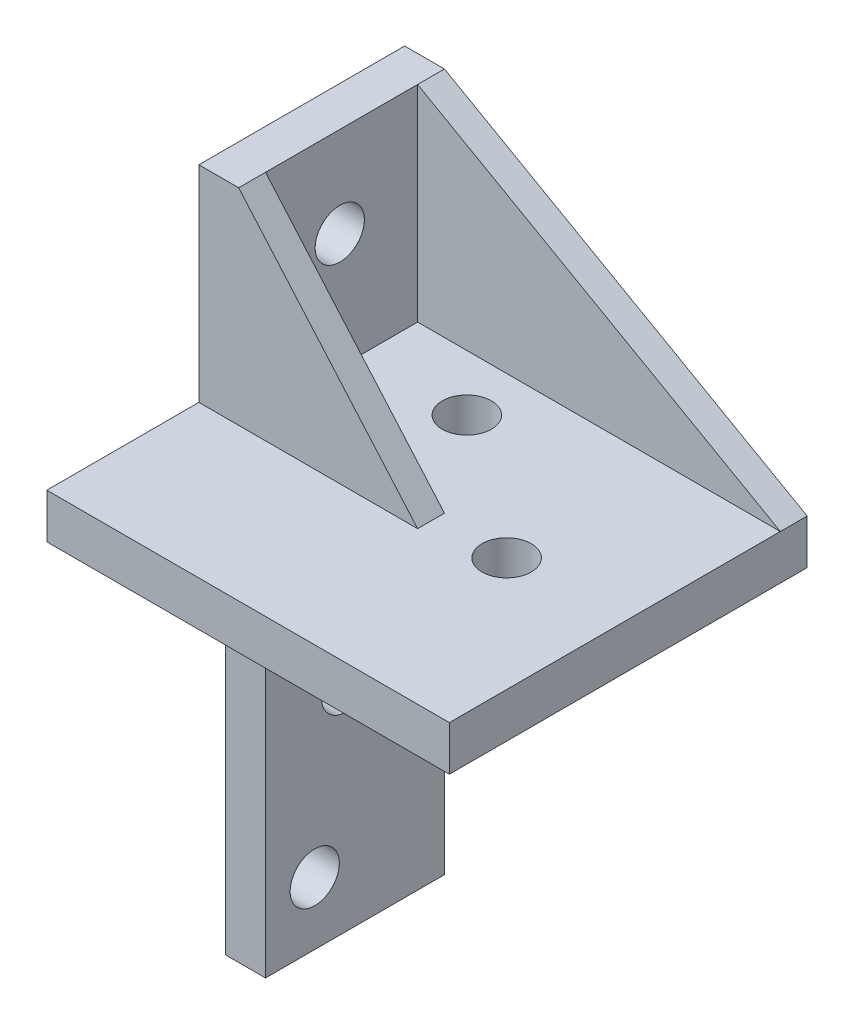
ISO-10303-21;
HEADER;
FILE_DESCRIPTION(('STEP AP214'),'2;1');
FILE_NAME('part.step','',(''),(''),'','','');
FILE_SCHEMA(('AUTOMOTIVE_DESIGN { 1 0 10303 214 1 1 1 1 }'));
ENDSEC;
DATA;
#1=APPLICATION_CONTEXT('core data for automotive mechanical design processes');
#2=APPLICATION_PROTOCOL_DEFINITION('international standard','automotive_design',2000,#1);
#3=PRODUCT_CONTEXT('',#1,'mechanical');
#4=PRODUCT('Part','Part','',(#3));
#5=PRODUCT_RELATED_PRODUCT_CATEGORY('part','',(#4));
#6=PRODUCT_DEFINITION_FORMATION('','',#4);
#7=PRODUCT_DEFINITION_CONTEXT('part definition',#1,'design');
#8=PRODUCT_DEFINITION('design','',#6,#7);
#9=PRODUCT_DEFINITION_SHAPE('','',#8);
#10=(LENGTH_UNIT() NAMED_UNIT(*) SI_UNIT(.MILLI.,.METRE.));
#11=(NAMED_UNIT(*) PLANE_ANGLE_UNIT() SI_UNIT($,.RADIAN.));
#12=(NAMED_UNIT(*) SI_UNIT($,.STERADIAN.) SOLID_ANGLE_UNIT());
#13=UNCERTAINTY_MEASURE_WITH_UNIT(LENGTH_MEASURE(1.E-05),#10,'distance_accuracy_value','');
#14=(GEOMETRIC_REPRESENTATION_CONTEXT(3) GLOBAL_UNCERTAINTY_ASSIGNED_CONTEXT((#13)) GLOBAL_UNIT_ASSIGNED_CONTEXT((#10,
#11,#12)) REPRESENTATION_CONTEXT('',''));
#15=CARTESIAN_POINT('',(0.,0.,0.));
#16=DIRECTION('',(0.,0.,1.));
#17=DIRECTION('',(1.,0.,0.));
#18=AXIS2_PLACEMENT_3D('',#15,#16,#17);
#19=CARTESIAN_POINT('',(4.45,0.,0.));
#20=DIRECTION('',(0.,0.,-1.));
#21=DIRECTION('',(-1.,0.,0.));
#22=AXIS2_PLACEMENT_3D('',#19,#20,#21);
#23=PLANE('',#22);
#24=DIRECTION('',(0.,-1.,0.));
#25=VECTOR('',#24,1.);
#26=CARTESIAN_POINT('',(0.,0.,0.));
#27=LINE('',#26,#25);
#28=CARTESIAN_POINT('',(0.,50.,0.));
#29=VERTEX_POINT('',#28);
#30=CARTESIAN_POINT('',(0.,0.,0.));
#31=VERTEX_POINT('',#30);
#32=EDGE_CURVE('E90',#29,#31,#27,.T.);
#33=ORIENTED_EDGE('',*,*,#32,.T.);
#34=DIRECTION('',(-1.,0.,0.));
#35=VECTOR('',#34,1.);
#36=CARTESIAN_POINT('',(4.45,0.,0.));
#37=LINE('',#36,#35);
#38=CARTESIAN_POINT('',(4.45,0.,0.));
#39=VERTEX_POINT('',#38);
#40=EDGE_CURVE('E11',#39,#31,#37,.T.);
#41=ORIENTED_EDGE('',*,*,#40,.F.);
#42=DIRECTION('',(0.,-1.,0.));
#43=VECTOR('',#42,1.);
#44=CARTESIAN_POINT('',(4.45,0.,0.));
#45=LINE('',#44,#43);
#46=CARTESIAN_POINT('',(4.45,50.,0.));
#47=VERTEX_POINT('',#46);
#48=EDGE_CURVE('E83',#47,#39,#45,.T.);
#49=ORIENTED_EDGE('',*,*,#48,.F.);
#50=DIRECTION('',(-1.,0.,0.));
#51=VECTOR('',#50,1.);
#52=CARTESIAN_POINT('',(4.45,50.,0.));
#53=LINE('',#52,#51);
#54=EDGE_CURVE('E48',#47,#29,#53,.T.);
#55=ORIENTED_EDGE('',*,*,#54,.T.);
#56=EDGE_LOOP('',(#33,#41,#49,#55));
#57=FACE_BOUND('',#56,.T.);
#58=ADVANCED_FACE('F32',(#57),#23,.F.);
#59=CARTESIAN_POINT('',(4.45,0.,0.));
#60=DIRECTION('',(0.,1.,0.));
#61=DIRECTION('',(0.,0.,1.));
#62=AXIS2_PLACEMENT_3D('',#59,#60,#61);
#63=PLANE('',#62);
#64=DIRECTION('',(0.,0.,-1.));
#65=VECTOR('',#64,1.);
#66=CARTESIAN_POINT('',(0.,0.,0.));
#67=LINE('',#66,#65);
#68=CARTESIAN_POINT('',(0.,0.,-20.));
#69=VERTEX_POINT('',#68);
#70=EDGE_CURVE('E61',#31,#69,#67,.T.);
#71=ORIENTED_EDGE('',*,*,#70,.T.);
#72=DIRECTION('',(-1.,0.,0.));
#73=VECTOR('',#72,1.);
#74=CARTESIAN_POINT('',(4.45,0.,-20.));
#75=LINE('',#74,#73);
#76=CARTESIAN_POINT('',(4.45,0.,-20.));
#77=VERTEX_POINT('',#76);
#78=EDGE_CURVE('E40',#77,#69,#75,.T.);
#79=ORIENTED_EDGE('',*,*,#78,.F.);
#80=DIRECTION('',(0.,0.,-1.));
#81=VECTOR('',#80,1.);
#82=CARTESIAN_POINT('',(4.45,0.,0.));
#83=LINE('',#82,#81);
#84=EDGE_CURVE('E73',#39,#77,#83,.T.);
#85=ORIENTED_EDGE('',*,*,#84,.F.);
#86=ORIENTED_EDGE('',*,*,#40,.T.);
#87=EDGE_LOOP('',(#71,#79,#85,#86));
#88=FACE_BOUND('',#87,.T.);
#89=ADVANCED_FACE('F75',(#88),#63,.F.);
#90=CARTESIAN_POINT('',(4.45,0.,-20.));
#91=DIRECTION('',(0.,0.,1.));
#92=DIRECTION('',(1.,0.,0.));
#93=AXIS2_PLACEMENT_3D('',#90,#91,#92);
#94=PLANE('',#93);
#95=DIRECTION('',(0.,1.,0.));
#96=VECTOR('',#95,1.);
#97=CARTESIAN_POINT('',(0.,0.,-20.));
#98=LINE('',#97,#96);
#99=CARTESIAN_POINT('',(0.,78.,-20.));
#100=VERTEX_POINT('',#99);
#101=EDGE_CURVE('E88',#69,#100,#98,.T.);
#102=ORIENTED_EDGE('',*,*,#101,.T.);
#103=DIRECTION('',(-1.,0.,0.));
#104=VECTOR('',#103,1.);
#105=CARTESIAN_POINT('',(0.,78.,-20.));
#106=LINE('',#105,#104);
#107=CARTESIAN_POINT('',(4.45,78.,-20.));
#108=VERTEX_POINT('',#107);
#109=EDGE_CURVE('E128',#108,#100,#106,.T.);
#110=ORIENTED_EDGE('',*,*,#109,.F.);
#111=DIRECTION('',(0.869822762844102,-0.493364329110095,0.));
#112=VECTOR('',#111,1.);
#113=CARTESIAN_POINT('',(45.,55.,-20.));
#114=LINE('',#113,#112);
#115=CARTESIAN_POINT('',(45.,55.,-20.));
#116=VERTEX_POINT('',#115);
#117=EDGE_CURVE('E206',#108,#116,#114,.T.);
#118=ORIENTED_EDGE('',*,*,#117,.T.);
#119=DIRECTION('',(0.,-1.,0.));
#120=VECTOR('',#119,1.);
#121=CARTESIAN_POINT('',(45.,55.,-20.));
#122=LINE('',#121,#120);
#123=CARTESIAN_POINT('',(45.,50.,-20.));
#124=VERTEX_POINT('',#123);
#125=EDGE_CURVE('E176',#116,#124,#122,.T.);
#126=ORIENTED_EDGE('',*,*,#125,.T.);
#127=DIRECTION('',(-1.,0.,0.));
#128=VECTOR('',#127,1.);
#129=CARTESIAN_POINT('',(0.,50.,-20.));
#130=LINE('',#129,#128);
#131=CARTESIAN_POINT('',(4.45,50.,-20.));
#132=VERTEX_POINT('',#131);
#133=EDGE_CURVE('E170',#124,#132,#130,.T.);
#134=ORIENTED_EDGE('',*,*,#133,.T.);
#135=DIRECTION('',(0.,1.,0.));
#136=VECTOR('',#135,1.);
#137=CARTESIAN_POINT('',(4.45,0.,-20.));
#138=LINE('',#137,#136);
#139=EDGE_CURVE('E82',#77,#132,#138,.T.);
#140=ORIENTED_EDGE('',*,*,#139,.F.);
#141=ORIENTED_EDGE('',*,*,#78,.T.);
#142=EDGE_LOOP('',(#102,#110,#118,#126,#134,#140,#141));
#143=FACE_BOUND('',#142,.T.);
#144=ADVANCED_FACE('F104',(#143),#94,.F.);
#145=CARTESIAN_POINT('',(4.45,0.,0.));
#146=DIRECTION('',(-1.,0.,0.));
#147=DIRECTION('',(0.,0.,1.));
#148=AXIS2_PLACEMENT_3D('',#145,#146,#147);
#149=PLANE('',#148);
#150=CARTESIAN_POINT('',(4.45,24.,-9.));
#151=DIRECTION('',(1.,0.,0.));
#152=DIRECTION('',(0.,0.,-1.));
#153=AXIS2_PLACEMENT_3D('',#150,#151,#152);
#154=CIRCLE('',#153,2.75);
#155=CARTESIAN_POINT('',(4.45,24.,-11.75));
#156=VERTEX_POINT('',#155);
#157=EDGE_CURVE('E146',#156,#156,#154,.T.);
#158=ORIENTED_EDGE('',*,*,#157,.F.);
#159=EDGE_LOOP('',(#158));
#160=FACE_BOUND('',#159,.T.);
#161=CARTESIAN_POINT('',(4.45,7.,-5.5));
#162=DIRECTION('',(1.,0.,0.));
#163=DIRECTION('',(0.,0.,-1.));
#164=AXIS2_PLACEMENT_3D('',#161,#162,#163);
#165=CIRCLE('',#164,2.75);
#166=CARTESIAN_POINT('',(4.45,7.,-8.25));
#167=VERTEX_POINT('',#166);
#168=EDGE_CURVE('E141',#167,#167,#165,.T.);
#169=ORIENTED_EDGE('',*,*,#168,.F.);
#170=EDGE_LOOP('',(#169));
#171=FACE_BOUND('',#170,.T.);
#172=ORIENTED_EDGE('',*,*,#48,.T.);
#173=ORIENTED_EDGE('',*,*,#84,.T.);
#174=ORIENTED_EDGE('',*,*,#139,.T.);
#175=DIRECTION('',(0.,0.,1.));
#176=VECTOR('',#175,1.);
#177=CARTESIAN_POINT('',(4.45,50.,0.));
#178=LINE('',#177,#176);
#179=EDGE_CURVE('E65',#132,#47,#178,.T.);
#180=ORIENTED_EDGE('',*,*,#179,.T.);
#181=EDGE_LOOP('',(#172,#173,#174,#180));
#182=FACE_BOUND('',#181,.T.);
#183=ADVANCED_FACE('F86',(#160,#171,#182),#149,.F.);
#184=CARTESIAN_POINT('',(0.,0.,0.));
#185=DIRECTION('',(-1.,0.,0.));
#186=DIRECTION('',(0.,0.,1.));
#187=AXIS2_PLACEMENT_3D('',#184,#185,#186);
#188=PLANE('',#187);
#189=DIRECTION('',(0.,0.,1.));
#190=VECTOR('',#189,1.);
#191=CARTESIAN_POINT('',(0.,55.,-20.));
#192=LINE('',#191,#190);
#193=CARTESIAN_POINT('',(0.,55.,3.));
#194=VERTEX_POINT('',#193);
#195=CARTESIAN_POINT('',(0.,55.,20.));
#196=VERTEX_POINT('',#195);
#197=EDGE_CURVE('E166',#194,#196,#192,.T.);
#198=ORIENTED_EDGE('',*,*,#197,.F.);
#199=DIRECTION('',(0.,-1.,0.));
#200=VECTOR('',#199,1.);
#201=CARTESIAN_POINT('',(0.,78.,3.));
#202=LINE('',#201,#200);
#203=CARTESIAN_POINT('',(0.,78.,3.));
#204=VERTEX_POINT('',#203);
#205=EDGE_CURVE('E117',#204,#194,#202,.T.);
#206=ORIENTED_EDGE('',*,*,#205,.F.);
#207=DIRECTION('',(0.,0.,1.));
#208=VECTOR('',#207,1.);
#209=CARTESIAN_POINT('',(0.,78.,-20.));
#210=LINE('',#209,#208);
#211=EDGE_CURVE('E114',#100,#204,#210,.T.);
#212=ORIENTED_EDGE('',*,*,#211,.F.);
#213=ORIENTED_EDGE('',*,*,#101,.F.);
#214=ORIENTED_EDGE('',*,*,#70,.F.);
#215=ORIENTED_EDGE('',*,*,#32,.F.);
#216=DIRECTION('',(0.,0.,1.));
#217=VECTOR('',#216,1.);
#218=CARTESIAN_POINT('',(0.,50.,-20.));
#219=LINE('',#218,#217);
#220=CARTESIAN_POINT('',(0.,50.,20.));
#221=VERTEX_POINT('',#220);
#222=EDGE_CURVE('E161',#29,#221,#219,.T.);
#223=ORIENTED_EDGE('',*,*,#222,.T.);
#224=DIRECTION('',(0.,-1.,0.));
#225=VECTOR('',#224,1.);
#226=CARTESIAN_POINT('',(0.,55.,20.));
#227=LINE('',#226,#225);
#228=EDGE_CURVE('E92',#196,#221,#227,.T.);
#229=ORIENTED_EDGE('',*,*,#228,.F.);
#230=EDGE_LOOP('',(#198,#206,#212,#213,#214,#215,#223,#229));
#231=FACE_BOUND('',#230,.T.);
#232=CARTESIAN_POINT('',(0.,67.9,-8.3));
#233=DIRECTION('',(1.,0.,0.));
#234=DIRECTION('',(0.,0.,-1.));
#235=AXIS2_PLACEMENT_3D('',#232,#233,#234);
#236=CIRCLE('',#235,2.75);
#237=CARTESIAN_POINT('',(0.,67.9,-11.05));
#238=VERTEX_POINT('',#237);
#239=EDGE_CURVE('E131',#238,#238,#236,.T.);
#240=ORIENTED_EDGE('',*,*,#239,.T.);
#241=EDGE_LOOP('',(#240));
#242=FACE_BOUND('',#241,.T.);
#243=CARTESIAN_POINT('',(0.,24.,-9.));
#244=DIRECTION('',(1.,0.,0.));
#245=DIRECTION('',(0.,0.,-1.));
#246=AXIS2_PLACEMENT_3D('',#243,#244,#245);
#247=CIRCLE('',#246,2.75);
#248=CARTESIAN_POINT('',(0.,24.,-11.75));
#249=VERTEX_POINT('',#248);
#250=EDGE_CURVE('E142',#249,#249,#247,.T.);
#251=ORIENTED_EDGE('',*,*,#250,.T.);
#252=EDGE_LOOP('',(#251));
#253=FACE_BOUND('',#252,.T.);
#254=CARTESIAN_POINT('',(0.,7.,-5.5));
#255=DIRECTION('',(1.,0.,0.));
#256=DIRECTION('',(0.,0.,-1.));
#257=AXIS2_PLACEMENT_3D('',#254,#255,#256);
#258=CIRCLE('',#257,2.75);
#259=CARTESIAN_POINT('',(0.,7.,-8.25));
#260=VERTEX_POINT('',#259);
#261=EDGE_CURVE('E149',#260,#260,#258,.T.);
#262=ORIENTED_EDGE('',*,*,#261,.T.);
#263=EDGE_LOOP('',(#262));
#264=FACE_BOUND('',#263,.T.);
#265=ADVANCED_FACE('F110',(#231,#242,#253,#264),#188,.T.);
#266=CARTESIAN_POINT('',(0.,55.,20.));
#267=DIRECTION('',(0.,0.,-1.));
#268=DIRECTION('',(-1.,0.,0.));
#269=AXIS2_PLACEMENT_3D('',#266,#267,#268);
#270=PLANE('',#269);
#271=DIRECTION('',(1.,0.,0.));
#272=VECTOR('',#271,1.);
#273=CARTESIAN_POINT('',(0.,50.,20.));
#274=LINE('',#273,#272);
#275=CARTESIAN_POINT('',(45.,50.,20.));
#276=VERTEX_POINT('',#275);
#277=EDGE_CURVE('E178',#221,#276,#274,.T.);
#278=ORIENTED_EDGE('',*,*,#277,.T.);
#279=DIRECTION('',(0.,-1.,0.));
#280=VECTOR('',#279,1.);
#281=CARTESIAN_POINT('',(45.,55.,20.));
#282=LINE('',#281,#280);
#283=CARTESIAN_POINT('',(45.,55.,20.));
#284=VERTEX_POINT('',#283);
#285=EDGE_CURVE('E96',#284,#276,#282,.T.);
#286=ORIENTED_EDGE('',*,*,#285,.F.);
#287=DIRECTION('',(1.,0.,0.));
#288=VECTOR('',#287,1.);
#289=CARTESIAN_POINT('',(0.,55.,20.));
#290=LINE('',#289,#288);
#291=EDGE_CURVE('E169',#196,#284,#290,.T.);
#292=ORIENTED_EDGE('',*,*,#291,.F.);
#293=ORIENTED_EDGE('',*,*,#228,.T.);
#294=EDGE_LOOP('',(#278,#286,#292,#293));
#295=FACE_BOUND('',#294,.T.);
#296=ADVANCED_FACE('F232',(#295),#270,.F.);
#297=CARTESIAN_POINT('',(45.,55.,-20.));
#298=DIRECTION('',(-1.,0.,0.));
#299=DIRECTION('',(0.,0.,1.));
#300=AXIS2_PLACEMENT_3D('',#297,#298,#299);
#301=PLANE('',#300);
#302=DIRECTION('',(0.,0.,-1.));
#303=VECTOR('',#302,1.);
#304=CARTESIAN_POINT('',(45.,50.,-20.));
#305=LINE('',#304,#303);
#306=EDGE_CURVE('E181',#276,#124,#305,.T.);
#307=ORIENTED_EDGE('',*,*,#306,.T.);
#308=ORIENTED_EDGE('',*,*,#125,.F.);
#309=DIRECTION('',(0.,0.,-1.));
#310=VECTOR('',#309,1.);
#311=CARTESIAN_POINT('',(45.,55.,-17.));
#312=LINE('',#311,#310);
#313=CARTESIAN_POINT('',(45.,55.,-17.));
#314=VERTEX_POINT('',#313);
#315=EDGE_CURVE('E209',#314,#116,#312,.T.);
#316=ORIENTED_EDGE('',*,*,#315,.F.);
#317=DIRECTION('',(0.,0.,-1.));
#318=VECTOR('',#317,1.);
#319=CARTESIAN_POINT('',(45.,55.,-20.));
#320=LINE('',#319,#318);
#321=EDGE_CURVE('E173',#284,#314,#320,.T.);
#322=ORIENTED_EDGE('',*,*,#321,.F.);
#323=ORIENTED_EDGE('',*,*,#285,.T.);
#324=EDGE_LOOP('',(#307,#308,#316,#322,#323));
#325=FACE_BOUND('',#324,.T.);
#326=ADVANCED_FACE('F193',(#325),#301,.F.);
#327=CARTESIAN_POINT('',(0.,55.,0.));
#328=DIRECTION('',(0.,1.,0.));
#329=DIRECTION('',(0.,0.,1.));
#330=AXIS2_PLACEMENT_3D('',#327,#328,#329);
#331=PLANE('',#330);
#332=DIRECTION('',(1.,0.,0.));
#333=VECTOR('',#332,1.);
#334=CARTESIAN_POINT('',(0.,55.,3.));
#335=LINE('',#334,#333);
#336=CARTESIAN_POINT('',(24.45,55.,3.));
#337=VERTEX_POINT('',#336);
#338=EDGE_CURVE('E240',#194,#337,#335,.T.);
#339=ORIENTED_EDGE('',*,*,#338,.F.);
#340=ORIENTED_EDGE('',*,*,#197,.T.);
#341=ORIENTED_EDGE('',*,*,#291,.T.);
#342=ORIENTED_EDGE('',*,*,#321,.T.);
#343=DIRECTION('',(-1.,0.,0.));
#344=VECTOR('',#343,1.);
#345=CARTESIAN_POINT('',(4.45,55.,-17.));
#346=LINE('',#345,#344);
#347=CARTESIAN_POINT('',(4.45,55.,-17.));
#348=VERTEX_POINT('',#347);
#349=EDGE_CURVE('E266',#314,#348,#346,.T.);
#350=ORIENTED_EDGE('',*,*,#349,.T.);
#351=DIRECTION('',(0.,0.,-1.));
#352=VECTOR('',#351,1.);
#353=CARTESIAN_POINT('',(4.45,55.,-20.));
#354=LINE('',#353,#352);
#355=CARTESIAN_POINT('',(4.45,55.,0.));
#356=VERTEX_POINT('',#355);
#357=EDGE_CURVE('E125',#356,#348,#354,.T.);
#358=ORIENTED_EDGE('',*,*,#357,.F.);
#359=DIRECTION('',(1.,0.,0.));
#360=VECTOR('',#359,1.);
#361=CARTESIAN_POINT('',(4.45,55.,0.));
#362=LINE('',#361,#360);
#363=CARTESIAN_POINT('',(24.45,55.,0.));
#364=VERTEX_POINT('',#363);
#365=EDGE_CURVE('E257',#356,#364,#362,.T.);
#366=ORIENTED_EDGE('',*,*,#365,.T.);
#367=DIRECTION('',(0.,0.,-1.));
#368=VECTOR('',#367,1.);
#369=CARTESIAN_POINT('',(24.45,55.,3.));
#370=LINE('',#369,#368);
#371=EDGE_CURVE('E244',#337,#364,#370,.T.);
#372=ORIENTED_EDGE('',*,*,#371,.F.);
#373=EDGE_LOOP('',(#339,#340,#341,#342,#350,#358,#366,#372));
#374=FACE_BOUND('',#373,.T.);
#375=CARTESIAN_POINT('',(32.25,55.,0.85));
#376=DIRECTION('',(0.,1.,0.));
#377=DIRECTION('',(0.,0.,1.));
#378=AXIS2_PLACEMENT_3D('',#375,#376,#377);
#379=CIRCLE('',#378,2.75);
#380=CARTESIAN_POINT('',(32.25,55.,3.6));
#381=VERTEX_POINT('',#380);
#382=EDGE_CURVE('E154',#381,#381,#379,.T.);
#383=ORIENTED_EDGE('',*,*,#382,.F.);
#384=EDGE_LOOP('',(#383));
#385=FACE_BOUND('',#384,.T.);
#386=CARTESIAN_POINT('',(16.2,55.,-10.75));
#387=DIRECTION('',(0.,1.,0.));
#388=DIRECTION('',(0.,0.,1.));
#389=AXIS2_PLACEMENT_3D('',#386,#387,#388);
#390=CIRCLE('',#389,2.75);
#391=CARTESIAN_POINT('',(16.2,55.,-8.));
#392=VERTEX_POINT('',#391);
#393=EDGE_CURVE('E145',#392,#392,#390,.T.);
#394=ORIENTED_EDGE('',*,*,#393,.F.);
#395=EDGE_LOOP('',(#394));
#396=FACE_BOUND('',#395,.T.);
#397=ADVANCED_FACE('F235',(#374,#385,#396),#331,.T.);
#398=CARTESIAN_POINT('',(0.,50.,0.));
#399=DIRECTION('',(0.,1.,0.));
#400=DIRECTION('',(0.,0.,1.));
#401=AXIS2_PLACEMENT_3D('',#398,#399,#400);
#402=PLANE('',#401);
#403=CARTESIAN_POINT('',(32.25,50.,0.85));
#404=DIRECTION('',(0.,1.,0.));
#405=DIRECTION('',(0.,0.,1.));
#406=AXIS2_PLACEMENT_3D('',#403,#404,#405);
#407=CIRCLE('',#406,2.75);
#408=CARTESIAN_POINT('',(32.25,50.,3.6));
#409=VERTEX_POINT('',#408);
#410=EDGE_CURVE('E157',#409,#409,#407,.F.);
#411=ORIENTED_EDGE('',*,*,#410,.F.);
#412=EDGE_LOOP('',(#411));
#413=FACE_BOUND('',#412,.T.);
#414=CARTESIAN_POINT('',(16.2,50.,-10.75));
#415=DIRECTION('',(0.,1.,0.));
#416=DIRECTION('',(0.,0.,1.));
#417=AXIS2_PLACEMENT_3D('',#414,#415,#416);
#418=CIRCLE('',#417,2.75);
#419=CARTESIAN_POINT('',(16.2,50.,-8.));
#420=VERTEX_POINT('',#419);
#421=EDGE_CURVE('E158',#420,#420,#418,.F.);
#422=ORIENTED_EDGE('',*,*,#421,.F.);
#423=EDGE_LOOP('',(#422));
#424=FACE_BOUND('',#423,.T.);
#425=ORIENTED_EDGE('',*,*,#54,.F.);
#426=ORIENTED_EDGE('',*,*,#179,.F.);
#427=ORIENTED_EDGE('',*,*,#133,.F.);
#428=ORIENTED_EDGE('',*,*,#306,.F.);
#429=ORIENTED_EDGE('',*,*,#277,.F.);
#430=ORIENTED_EDGE('',*,*,#222,.F.);
#431=EDGE_LOOP('',(#425,#426,#427,#428,#429,#430));
#432=FACE_BOUND('',#431,.T.);
#433=ADVANCED_FACE('F201',(#413,#424,#432),#402,.F.);
#434=CARTESIAN_POINT('',(16.2,-0.001000000000001,-10.75));
#435=DIRECTION('',(0.,1.,0.));
#436=DIRECTION('',(0.,0.,1.));
#437=AXIS2_PLACEMENT_3D('',#434,#435,#436);
#438=CYLINDRICAL_SURFACE('',#437,2.75);
#439=CARTESIAN_POINT('',(16.2,55.,-8.));
#440=CARTESIAN_POINT('',(16.2,54.9479166666667,-8.));
#441=CARTESIAN_POINT('',(16.2,54.8958333333333,-8.));
#442=CARTESIAN_POINT('',(16.2,54.7916666666667,-8.));
#443=CARTESIAN_POINT('',(16.2,54.7395833333333,-8.));
#444=CARTESIAN_POINT('',(16.2,54.6354166666667,-8.));
#445=CARTESIAN_POINT('',(16.2,54.5833333333333,-8.));
#446=CARTESIAN_POINT('',(16.2,54.4791666666667,-8.));
#447=CARTESIAN_POINT('',(16.2,54.4270833333333,-8.));
#448=CARTESIAN_POINT('',(16.2,54.3229166666667,-8.));
#449=CARTESIAN_POINT('',(16.2,54.2708333333333,-8.));
#450=CARTESIAN_POINT('',(16.2,54.1666666666667,-8.));
#451=CARTESIAN_POINT('',(16.2,54.1145833333333,-8.));
#452=CARTESIAN_POINT('',(16.2,54.0104166666667,-8.));
#453=CARTESIAN_POINT('',(16.2,53.9583333333333,-8.));
#454=CARTESIAN_POINT('',(16.2,53.8541666666667,-8.));
#455=CARTESIAN_POINT('',(16.2,53.8020833333333,-8.));
#456=CARTESIAN_POINT('',(16.2,53.6979166666667,-8.));
#457=CARTESIAN_POINT('',(16.2,53.6458333333333,-8.));
#458=CARTESIAN_POINT('',(16.2,53.5416666666667,-8.));
#459=CARTESIAN_POINT('',(16.2,53.4895833333333,-8.));
#460=CARTESIAN_POINT('',(16.2,53.3854166666667,-8.));
#461=CARTESIAN_POINT('',(16.2,53.3333333333333,-8.));
#462=CARTESIAN_POINT('',(16.2,53.2291666666667,-8.));
#463=CARTESIAN_POINT('',(16.2,53.1770833333333,-8.));
#464=CARTESIAN_POINT('',(16.2,53.0729166666667,-8.));
#465=CARTESIAN_POINT('',(16.2,53.0208333333333,-8.));
#466=CARTESIAN_POINT('',(16.2,52.9166666666667,-8.));
#467=CARTESIAN_POINT('',(16.2,52.8645833333333,-8.));
#468=CARTESIAN_POINT('',(16.2,52.7604166666667,-8.));
#469=CARTESIAN_POINT('',(16.2,52.7083333333333,-8.));
#470=CARTESIAN_POINT('',(16.2,52.6041666666667,-8.));
#471=CARTESIAN_POINT('',(16.2,52.5520833333333,-8.));
#472=CARTESIAN_POINT('',(16.2,52.4479166666667,-8.));
#473=CARTESIAN_POINT('',(16.2,52.3958333333333,-8.));
#474=CARTESIAN_POINT('',(16.2,52.2916666666667,-8.));
#475=CARTESIAN_POINT('',(16.2,52.2395833333333,-8.));
#476=CARTESIAN_POINT('',(16.2,52.1354166666667,-8.));
#477=CARTESIAN_POINT('',(16.2,52.0833333333333,-8.));
#478=CARTESIAN_POINT('',(16.2,51.9791666666667,-8.));
#479=CARTESIAN_POINT('',(16.2,51.9270833333333,-8.));
#480=CARTESIAN_POINT('',(16.2,51.8229166666667,-8.));
#481=CARTESIAN_POINT('',(16.2,51.7708333333333,-8.));
#482=CARTESIAN_POINT('',(16.2,51.6666666666667,-8.));
#483=CARTESIAN_POINT('',(16.2,51.6145833333333,-8.));
#484=CARTESIAN_POINT('',(16.2,51.5104166666667,-8.));
#485=CARTESIAN_POINT('',(16.2,51.4583333333333,-8.));
#486=CARTESIAN_POINT('',(16.2,51.3541666666667,-8.));
#487=CARTESIAN_POINT('',(16.2,51.3020833333333,-8.));
#488=CARTESIAN_POINT('',(16.2,51.1979166666667,-8.));
#489=CARTESIAN_POINT('',(16.2,51.1458333333333,-8.));
#490=CARTESIAN_POINT('',(16.2,51.0416666666667,-8.));
#491=CARTESIAN_POINT('',(16.2,50.9895833333333,-8.));
#492=CARTESIAN_POINT('',(16.2,50.8854166666667,-8.));
#493=CARTESIAN_POINT('',(16.2,50.8333333333333,-8.));
#494=CARTESIAN_POINT('',(16.2,50.7291666666667,-8.));
#495=CARTESIAN_POINT('',(16.2,50.6770833333333,-8.));
#496=CARTESIAN_POINT('',(16.2,50.5729166666667,-8.));
#497=CARTESIAN_POINT('',(16.2,50.5208333333333,-8.));
#498=CARTESIAN_POINT('',(16.2,50.4166666666667,-8.));
#499=CARTESIAN_POINT('',(16.2,50.3645833333333,-8.));
#500=CARTESIAN_POINT('',(16.2,50.2604166666667,-8.));
#501=CARTESIAN_POINT('',(16.2,50.2083333333333,-8.));
#502=CARTESIAN_POINT('',(16.2,50.1041666666667,-8.));
#503=CARTESIAN_POINT('',(16.2,50.0520833333333,-8.));
#504=CARTESIAN_POINT('',(16.2,50.,-8.));
#505=B_SPLINE_CURVE_WITH_KNOTS('',3,(#439,#440,#441,#442,#443,#444,#445,#446,#447,#448,#449,
#450,#451,#452,#453,#454,#455,#456,#457,#458,#459,#460,#461,#462,#463,#464,#465,#466,#467,#468,
#469,#470,#471,#472,#473,#474,#475,#476,#477,#478,#479,#480,#481,#482,#483,#484,#485,#486,#487,
#488,#489,#490,#491,#492,#493,#494,#495,#496,#497,#498,#499,#500,#501,#502,#503,#504),
.UNSPECIFIED.,.F.,.F.,(4,2,2,2,2,2,2,2,2,2,2,2,2,2,2,2,2,2,2,2,2,2,2,2,2,2,2,2,2,2,2,2,4),(0.,
0.156249999999997,0.3125,0.468750000000004,0.625000000000001,0.781249999999997,
0.937500000000001,1.09375,1.25,1.40625,1.5625,1.71875,1.875,2.03125,2.1875,2.34375000000001,2.5,
2.65625,2.8125,2.96875000000001,3.125,3.28125,3.4375,3.59375000000001,3.75,3.90625,4.0625,
4.21875000000001,4.375,4.53125,4.6875,4.84375000000001,5.),.UNSPECIFIED.);
#506=EDGE_CURVE('BSEAM334',#392,#420,#505,.T.);
#507=ORIENTED_EDGE('',*,*,#393,.T.);
#508=ORIENTED_EDGE('',*,*,#421,.T.);
#509=ORIENTED_EDGE('',*,*,#506,.T.);
#510=ORIENTED_EDGE('',*,*,#506,.F.);
#511=EDGE_LOOP('',(#507,#509,#508,#510));
#512=FACE_BOUND('',#511,.T.);
#513=ADVANCED_FACE('F334',(#512),#438,.F.);
#514=CARTESIAN_POINT('',(32.25,-0.001000000000001,0.85));
#515=DIRECTION('',(0.,1.,0.));
#516=DIRECTION('',(0.,0.,1.));
#517=AXIS2_PLACEMENT_3D('',#514,#515,#516);
#518=CYLINDRICAL_SURFACE('',#517,2.75);
#519=CARTESIAN_POINT('',(32.25,55.,3.6));
#520=CARTESIAN_POINT('',(32.25,54.9479166666667,3.6));
#521=CARTESIAN_POINT('',(32.25,54.8958333333333,3.6));
#522=CARTESIAN_POINT('',(32.25,54.7916666666667,3.6));
#523=CARTESIAN_POINT('',(32.25,54.7395833333333,3.6));
#524=CARTESIAN_POINT('',(32.25,54.6354166666667,3.6));
#525=CARTESIAN_POINT('',(32.25,54.5833333333333,3.6));
#526=CARTESIAN_POINT('',(32.25,54.4791666666667,3.6));
#527=CARTESIAN_POINT('',(32.25,54.4270833333333,3.6));
#528=CARTESIAN_POINT('',(32.25,54.3229166666667,3.6));
#529=CARTESIAN_POINT('',(32.25,54.2708333333333,3.6));
#530=CARTESIAN_POINT('',(32.25,54.1666666666667,3.6));
#531=CARTESIAN_POINT('',(32.25,54.1145833333333,3.6));
#532=CARTESIAN_POINT('',(32.25,54.0104166666667,3.6));
#533=CARTESIAN_POINT('',(32.25,53.9583333333333,3.6));
#534=CARTESIAN_POINT('',(32.25,53.8541666666667,3.6));
#535=CARTESIAN_POINT('',(32.25,53.8020833333333,3.6));
#536=CARTESIAN_POINT('',(32.25,53.6979166666667,3.6));
#537=CARTESIAN_POINT('',(32.25,53.6458333333333,3.6));
#538=CARTESIAN_POINT('',(32.25,53.5416666666667,3.6));
#539=CARTESIAN_POINT('',(32.25,53.4895833333333,3.6));
#540=CARTESIAN_POINT('',(32.25,53.3854166666667,3.6));
#541=CARTESIAN_POINT('',(32.25,53.3333333333333,3.6));
#542=CARTESIAN_POINT('',(32.25,53.2291666666667,3.6));
#543=CARTESIAN_POINT('',(32.25,53.1770833333333,3.6));
#544=CARTESIAN_POINT('',(32.25,53.0729166666667,3.6));
#545=CARTESIAN_POINT('',(32.25,53.0208333333333,3.6));
#546=CARTESIAN_POINT('',(32.25,52.9166666666667,3.6));
#547=CARTESIAN_POINT('',(32.25,52.8645833333333,3.6));
#548=CARTESIAN_POINT('',(32.25,52.7604166666667,3.6));
#549=CARTESIAN_POINT('',(32.25,52.7083333333333,3.6));
#550=CARTESIAN_POINT('',(32.25,52.6041666666667,3.6));
#551=CARTESIAN_POINT('',(32.25,52.5520833333333,3.6));
#552=CARTESIAN_POINT('',(32.25,52.4479166666667,3.6));
#553=CARTESIAN_POINT('',(32.25,52.3958333333333,3.6));
#554=CARTESIAN_POINT('',(32.25,52.2916666666667,3.6));
#555=CARTESIAN_POINT('',(32.25,52.2395833333333,3.6));
#556=CARTESIAN_POINT('',(32.25,52.1354166666667,3.6));
#557=CARTESIAN_POINT('',(32.25,52.0833333333333,3.6));
#558=CARTESIAN_POINT('',(32.25,51.9791666666667,3.6));
#559=CARTESIAN_POINT('',(32.25,51.9270833333333,3.6));
#560=CARTESIAN_POINT('',(32.25,51.8229166666667,3.6));
#561=CARTESIAN_POINT('',(32.25,51.7708333333333,3.6));
#562=CARTESIAN_POINT('',(32.25,51.6666666666667,3.6));
#563=CARTESIAN_POINT('',(32.25,51.6145833333333,3.6));
#564=CARTESIAN_POINT('',(32.25,51.5104166666667,3.6));
#565=CARTESIAN_POINT('',(32.25,51.4583333333333,3.6));
#566=CARTESIAN_POINT('',(32.25,51.3541666666667,3.6));
#567=CARTESIAN_POINT('',(32.25,51.3020833333333,3.6));
#568=CARTESIAN_POINT('',(32.25,51.1979166666667,3.6));
#569=CARTESIAN_POINT('',(32.25,51.1458333333333,3.6));
#570=CARTESIAN_POINT('',(32.25,51.0416666666667,3.6));
#571=CARTESIAN_POINT('',(32.25,50.9895833333333,3.6));
#572=CARTESIAN_POINT('',(32.25,50.8854166666667,3.6));
#573=CARTESIAN_POINT('',(32.25,50.8333333333333,3.6));
#574=CARTESIAN_POINT('',(32.25,50.7291666666667,3.6));
#575=CARTESIAN_POINT('',(32.25,50.6770833333333,3.6));
#576=CARTESIAN_POINT('',(32.25,50.5729166666667,3.6));
#577=CARTESIAN_POINT('',(32.25,50.5208333333333,3.6));
#578=CARTESIAN_POINT('',(32.25,50.4166666666667,3.6));
#579=CARTESIAN_POINT('',(32.25,50.3645833333333,3.6));
#580=CARTESIAN_POINT('',(32.25,50.2604166666667,3.6));
#581=CARTESIAN_POINT('',(32.25,50.2083333333333,3.6));
#582=CARTESIAN_POINT('',(32.25,50.1041666666667,3.6));
#583=CARTESIAN_POINT('',(32.25,50.0520833333333,3.6));
#584=CARTESIAN_POINT('',(32.25,50.,3.6));
#585=B_SPLINE_CURVE_WITH_KNOTS('',3,(#519,#520,#521,#522,#523,#524,#525,#526,#527,#528,#529,
#530,#531,#532,#533,#534,#535,#536,#537,#538,#539,#540,#541,#542,#543,#544,#545,#546,#547,#548,
#549,#550,#551,#552,#553,#554,#555,#556,#557,#558,#559,#560,#561,#562,#563,#564,#565,#566,#567,
#568,#569,#570,#571,#572,#573,#574,#575,#576,#577,#578,#579,#580,#581,#582,#583,#584),
.UNSPECIFIED.,.F.,.F.,(4,2,2,2,2,2,2,2,2,2,2,2,2,2,2,2,2,2,2,2,2,2,2,2,2,2,2,2,2,2,2,2,4),(0.,
0.156249999999997,0.3125,0.468750000000004,0.625000000000001,0.781249999999997,
0.937500000000001,1.09375,1.25,1.40625,1.5625,1.71875,1.875,2.03125,2.1875,2.34375000000001,2.5,
2.65625,2.8125,2.96875000000001,3.125,3.28125,3.4375,3.59375000000001,3.75,3.90625,4.0625,
4.21875000000001,4.375,4.53125,4.6875,4.84375000000001,5.),.UNSPECIFIED.);
#586=EDGE_CURVE('BSEAM340',#381,#409,#585,.T.);
#587=ORIENTED_EDGE('',*,*,#382,.T.);
#588=ORIENTED_EDGE('',*,*,#410,.T.);
#589=ORIENTED_EDGE('',*,*,#586,.T.);
#590=ORIENTED_EDGE('',*,*,#586,.F.);
#591=EDGE_LOOP('',(#587,#589,#588,#590));
#592=FACE_BOUND('',#591,.T.);
#593=ADVANCED_FACE('F340',(#592),#518,.F.);
#594=CARTESIAN_POINT('',(0.,7.,-5.5));
#595=DIRECTION('',(1.,0.,0.));
#596=DIRECTION('',(0.,0.,-1.));
#597=AXIS2_PLACEMENT_3D('',#594,#595,#596);
#598=CYLINDRICAL_SURFACE('',#597,2.75);
#599=ORIENTED_EDGE('',*,*,#261,.F.);
#600=EDGE_LOOP('',(#599));
#601=FACE_BOUND('',#600,.T.);
#602=ORIENTED_EDGE('',*,*,#168,.T.);
#603=EDGE_LOOP('',(#602));
#604=FACE_BOUND('',#603,.T.);
#605=ADVANCED_FACE('F344',(#601,#604),#598,.F.);
#606=CARTESIAN_POINT('',(0.,24.,-9.));
#607=DIRECTION('',(1.,0.,0.));
#608=DIRECTION('',(0.,0.,-1.));
#609=AXIS2_PLACEMENT_3D('',#606,#607,#608);
#610=CYLINDRICAL_SURFACE('',#609,2.75);
#611=ORIENTED_EDGE('',*,*,#250,.F.);
#612=EDGE_LOOP('',(#611));
#613=FACE_BOUND('',#612,.T.);
#614=ORIENTED_EDGE('',*,*,#157,.T.);
#615=EDGE_LOOP('',(#614));
#616=FACE_BOUND('',#615,.T.);
#617=ADVANCED_FACE('F286',(#613,#616),#610,.F.);
#618=CARTESIAN_POINT('',(4.45,78.,-20.));
#619=DIRECTION('',(-1.,0.,0.));
#620=DIRECTION('',(0.,0.,1.));
#621=AXIS2_PLACEMENT_3D('',#618,#619,#620);
#622=PLANE('',#621);
#623=CARTESIAN_POINT('',(4.45,67.9,-8.3));
#624=DIRECTION('',(1.,0.,0.));
#625=DIRECTION('',(0.,0.,-1.));
#626=AXIS2_PLACEMENT_3D('',#623,#624,#625);
#627=CIRCLE('',#626,2.75);
#628=CARTESIAN_POINT('',(4.45,67.9,-11.05));
#629=VERTEX_POINT('',#628);
#630=EDGE_CURVE('E134',#629,#629,#627,.T.);
#631=ORIENTED_EDGE('',*,*,#630,.F.);
#632=EDGE_LOOP('',(#631));
#633=FACE_BOUND('',#632,.T.);
#634=ORIENTED_EDGE('',*,*,#357,.T.);
#635=DIRECTION('',(0.,1.,0.));
#636=VECTOR('',#635,1.);
#637=CARTESIAN_POINT('',(4.45,78.,-17.));
#638=LINE('',#637,#636);
#639=CARTESIAN_POINT('',(4.45,78.,-17.));
#640=VERTEX_POINT('',#639);
#641=EDGE_CURVE('E268',#348,#640,#638,.T.);
#642=ORIENTED_EDGE('',*,*,#641,.T.);
#643=DIRECTION('',(0.,0.,-1.));
#644=VECTOR('',#643,1.);
#645=CARTESIAN_POINT('',(4.45,78.,-20.));
#646=LINE('',#645,#644);
#647=CARTESIAN_POINT('',(4.45,78.,0.));
#648=VERTEX_POINT('',#647);
#649=EDGE_CURVE('E124',#648,#640,#646,.T.);
#650=ORIENTED_EDGE('',*,*,#649,.F.);
#651=DIRECTION('',(0.,-1.,0.));
#652=VECTOR('',#651,1.);
#653=CARTESIAN_POINT('',(4.45,78.,0.));
#654=LINE('',#653,#652);
#655=EDGE_CURVE('E137',#648,#356,#654,.T.);
#656=ORIENTED_EDGE('',*,*,#655,.T.);
#657=EDGE_LOOP('',(#634,#642,#650,#656));
#658=FACE_BOUND('',#657,.T.);
#659=ADVANCED_FACE('F282',(#633,#658),#622,.F.);
#660=CARTESIAN_POINT('',(0.,78.,0.));
#661=DIRECTION('',(0.,1.,0.));
#662=DIRECTION('',(0.,0.,1.));
#663=AXIS2_PLACEMENT_3D('',#660,#661,#662);
#664=PLANE('',#663);
#665=ORIENTED_EDGE('',*,*,#211,.T.);
#666=DIRECTION('',(-1.,0.,0.));
#667=VECTOR('',#666,1.);
#668=CARTESIAN_POINT('',(4.45,78.,3.));
#669=LINE('',#668,#667);
#670=CARTESIAN_POINT('',(4.45,78.,3.));
#671=VERTEX_POINT('',#670);
#672=EDGE_CURVE('E253',#671,#204,#669,.T.);
#673=ORIENTED_EDGE('',*,*,#672,.F.);
#674=DIRECTION('',(0.,0.,-1.));
#675=VECTOR('',#674,1.);
#676=CARTESIAN_POINT('',(4.45,78.,3.));
#677=LINE('',#676,#675);
#678=EDGE_CURVE('E251',#671,#648,#677,.T.);
#679=ORIENTED_EDGE('',*,*,#678,.T.);
#680=ORIENTED_EDGE('',*,*,#649,.T.);
#681=DIRECTION('',(0.,0.,-1.));
#682=VECTOR('',#681,1.);
#683=CARTESIAN_POINT('',(4.45,78.,-17.));
#684=LINE('',#683,#682);
#685=EDGE_CURVE('E272',#640,#108,#684,.T.);
#686=ORIENTED_EDGE('',*,*,#685,.T.);
#687=ORIENTED_EDGE('',*,*,#109,.T.);
#688=EDGE_LOOP('',(#665,#673,#679,#680,#686,#687));
#689=FACE_BOUND('',#688,.T.);
#690=ADVANCED_FACE('F285',(#689),#664,.T.);
#691=CARTESIAN_POINT('',(0.,67.9,-8.3));
#692=DIRECTION('',(1.,0.,0.));
#693=DIRECTION('',(0.,0.,-1.));
#694=AXIS2_PLACEMENT_3D('',#691,#692,#693);
#695=CYLINDRICAL_SURFACE('',#694,2.75);
#696=ORIENTED_EDGE('',*,*,#239,.F.);
#697=EDGE_LOOP('',(#696));
#698=FACE_BOUND('',#697,.T.);
#699=ORIENTED_EDGE('',*,*,#630,.T.);
#700=EDGE_LOOP('',(#699));
#701=FACE_BOUND('',#700,.T.);
#702=ADVANCED_FACE('F280',(#698,#701),#695,.F.);
#703=CARTESIAN_POINT('',(45.,55.,-17.));
#704=DIRECTION('',(0.493364329110095,0.869822762844102,0.));
#705=DIRECTION('',(-0.869822762844102,0.493364329110095,0.));
#706=AXIS2_PLACEMENT_3D('',#703,#704,#705);
#707=PLANE('',#706);
#708=ORIENTED_EDGE('',*,*,#117,.F.);
#709=ORIENTED_EDGE('',*,*,#685,.F.);
#710=DIRECTION('',(0.869822762844102,-0.493364329110095,0.));
#711=VECTOR('',#710,1.);
#712=CARTESIAN_POINT('',(45.,55.,-17.));
#713=LINE('',#712,#711);
#714=EDGE_CURVE('E264',#640,#314,#713,.T.);
#715=ORIENTED_EDGE('',*,*,#714,.T.);
#716=ORIENTED_EDGE('',*,*,#315,.T.);
#717=EDGE_LOOP('',(#708,#709,#715,#716));
#718=FACE_BOUND('',#717,.T.);
#719=ADVANCED_FACE('F297',(#718),#707,.T.);
#720=CARTESIAN_POINT('',(0.,0.,-17.));
#721=DIRECTION('',(0.,0.,1.));
#722=DIRECTION('',(1.,0.,0.));
#723=AXIS2_PLACEMENT_3D('',#720,#721,#722);
#724=PLANE('',#723);
#725=ORIENTED_EDGE('',*,*,#714,.F.);
#726=ORIENTED_EDGE('',*,*,#641,.F.);
#727=ORIENTED_EDGE('',*,*,#349,.F.);
#728=EDGE_LOOP('',(#725,#726,#727));
#729=FACE_BOUND('',#728,.T.);
#730=ADVANCED_FACE('F295',(#729),#724,.T.);
#731=CARTESIAN_POINT('',(0.,0.,0.));
#732=DIRECTION('',(0.,0.,1.));
#733=DIRECTION('',(1.,0.,0.));
#734=AXIS2_PLACEMENT_3D('',#731,#732,#733);
#735=PLANE('',#734);
#736=ORIENTED_EDGE('',*,*,#365,.F.);
#737=ORIENTED_EDGE('',*,*,#655,.F.);
#738=DIRECTION('',(-0.656178714924787,0.754605522163505,0.));
#739=VECTOR('',#738,1.);
#740=CARTESIAN_POINT('',(24.45,55.,0.));
#741=LINE('',#740,#739);
#742=EDGE_CURVE('E259',#364,#648,#741,.T.);
#743=ORIENTED_EDGE('',*,*,#742,.F.);
#744=EDGE_LOOP('',(#736,#737,#743));
#745=FACE_BOUND('',#744,.T.);
#746=ADVANCED_FACE('F303',(#745),#735,.F.);
#747=CARTESIAN_POINT('',(24.45,55.,3.));
#748=DIRECTION('',(-0.754605522163505,-0.656178714924787,0.));
#749=DIRECTION('',(0.656178714924787,-0.754605522163505,0.));
#750=AXIS2_PLACEMENT_3D('',#747,#748,#749);
#751=PLANE('',#750);
#752=ORIENTED_EDGE('',*,*,#742,.T.);
#753=ORIENTED_EDGE('',*,*,#678,.F.);
#754=DIRECTION('',(-0.656178714924787,0.754605522163505,0.));
#755=VECTOR('',#754,1.);
#756=CARTESIAN_POINT('',(24.45,55.,3.));
#757=LINE('',#756,#755);
#758=EDGE_CURVE('E249',#337,#671,#757,.T.);
#759=ORIENTED_EDGE('',*,*,#758,.F.);
#760=ORIENTED_EDGE('',*,*,#371,.T.);
#761=EDGE_LOOP('',(#752,#753,#759,#760));
#762=FACE_BOUND('',#761,.T.);
#763=ADVANCED_FACE('F301',(#762),#751,.F.);
#764=CARTESIAN_POINT('',(0.,0.,3.));
#765=DIRECTION('',(0.,0.,1.));
#766=DIRECTION('',(1.,0.,0.));
#767=AXIS2_PLACEMENT_3D('',#764,#765,#766);
#768=PLANE('',#767);
#769=ORIENTED_EDGE('',*,*,#672,.T.);
#770=ORIENTED_EDGE('',*,*,#205,.T.);
#771=ORIENTED_EDGE('',*,*,#338,.T.);
#772=ORIENTED_EDGE('',*,*,#758,.T.);
#773=EDGE_LOOP('',(#769,#770,#771,#772));
#774=FACE_BOUND('',#773,.T.);
#775=ADVANCED_FACE('F310',(#774),#768,.T.);
#776=CLOSED_SHELL('',(#58,#89,#144,#183,#265,#296,#326,#397,#433,#513,#593,#605,#617,#659,#690,
#702,#719,#730,#746,#763,#775));
#777=MANIFOLD_SOLID_BREP('B2',#776);
#778=ADVANCED_BREP_SHAPE_REPRESENTATION('',(#18,#777),#14);
#779=SHAPE_DEFINITION_REPRESENTATION(#9,#778);
ENDSEC;
END-ISO-10303-21;
